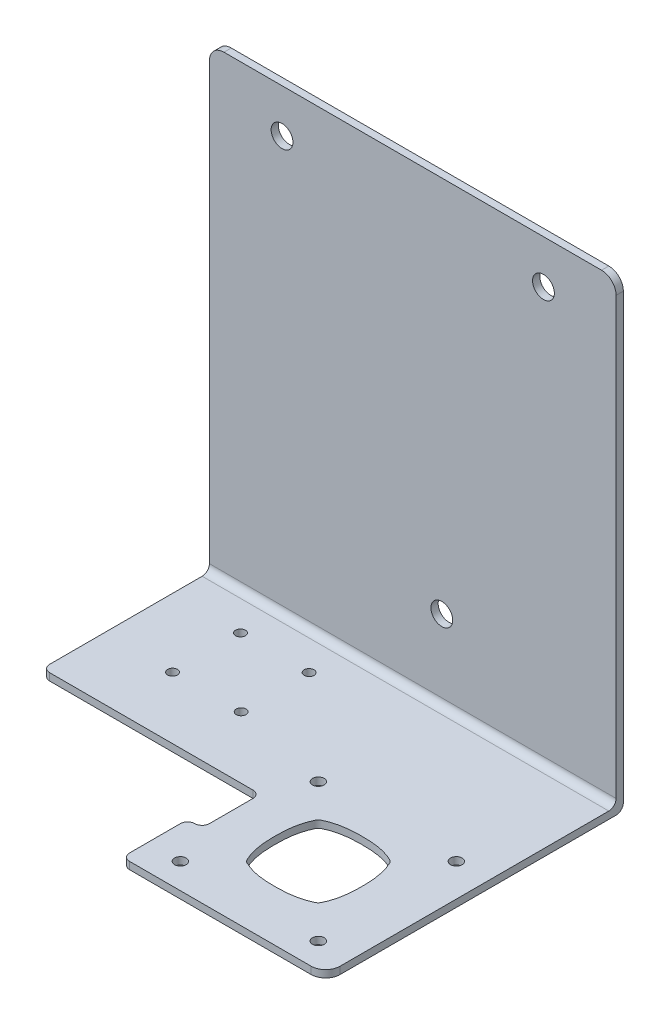
ISO-10303-21;
HEADER;
FILE_DESCRIPTION(('STEP AP214'),'2;1');
FILE_NAME('part.step','',(''),(''),'','','');
FILE_SCHEMA(('AUTOMOTIVE_DESIGN { 1 0 10303 214 1 1 1 1 }'));
ENDSEC;
DATA;
#1=APPLICATION_CONTEXT('core data for automotive mechanical design processes');
#2=APPLICATION_PROTOCOL_DEFINITION('international standard','automotive_design',2000,#1);
#3=PRODUCT_CONTEXT('',#1,'mechanical');
#4=PRODUCT('Part','Part','',(#3));
#5=PRODUCT_RELATED_PRODUCT_CATEGORY('part','',(#4));
#6=PRODUCT_DEFINITION_FORMATION('','',#4);
#7=PRODUCT_DEFINITION_CONTEXT('part definition',#1,'design');
#8=PRODUCT_DEFINITION('design','',#6,#7);
#9=PRODUCT_DEFINITION_SHAPE('','',#8);
#10=(LENGTH_UNIT() NAMED_UNIT(*) SI_UNIT(.MILLI.,.METRE.));
#11=(NAMED_UNIT(*) PLANE_ANGLE_UNIT() SI_UNIT($,.RADIAN.));
#12=(NAMED_UNIT(*) SI_UNIT($,.STERADIAN.) SOLID_ANGLE_UNIT());
#13=UNCERTAINTY_MEASURE_WITH_UNIT(LENGTH_MEASURE(1.E-05),#10,'distance_accuracy_value','');
#14=(GEOMETRIC_REPRESENTATION_CONTEXT(3) GLOBAL_UNCERTAINTY_ASSIGNED_CONTEXT((#13)) GLOBAL_UNIT_ASSIGNED_CONTEXT((#10,
#11,#12)) REPRESENTATION_CONTEXT('',''));
#15=CARTESIAN_POINT('',(0.,0.,0.));
#16=DIRECTION('',(0.,0.,1.));
#17=DIRECTION('',(1.,0.,0.));
#18=AXIS2_PLACEMENT_3D('',#15,#16,#17);
#19=CARTESIAN_POINT('',(0.,0.,3.175));
#20=DIRECTION('',(0.,0.,-1.));
#21=DIRECTION('',(-1.,0.,0.));
#22=AXIS2_PLACEMENT_3D('',#19,#20,#21);
#23=PLANE('',#22);
#24=CARTESIAN_POINT('',(-57.15,82.55,3.175));
#25=DIRECTION('',(0.,0.,1.));
#26=DIRECTION('',(1.,0.,0.));
#27=AXIS2_PLACEMENT_3D('',#24,#25,#26);
#28=CIRCLE('',#27,4.7625);
#29=CARTESIAN_POINT('',(-52.3875,82.55,3.175));
#30=VERTEX_POINT('',#29);
#31=EDGE_CURVE('E524',#30,#30,#28,.T.);
#32=ORIENTED_EDGE('',*,*,#31,.F.);
#33=EDGE_LOOP('',(#32));
#34=FACE_BOUND('',#33,.T.);
#35=CARTESIAN_POINT('',(57.15,82.55,3.175));
#36=DIRECTION('',(0.,0.,1.));
#37=DIRECTION('',(1.,0.,0.));
#38=AXIS2_PLACEMENT_3D('',#35,#36,#37);
#39=CIRCLE('',#38,4.7625);
#40=CARTESIAN_POINT('',(61.9125,82.55,3.175));
#41=VERTEX_POINT('',#40);
#42=EDGE_CURVE('E518',#41,#41,#39,.T.);
#43=ORIENTED_EDGE('',*,*,#42,.F.);
#44=EDGE_LOOP('',(#43));
#45=FACE_BOUND('',#44,.T.);
#46=CARTESIAN_POINT('',(12.7,-63.5,3.175));
#47=DIRECTION('',(0.,0.,1.));
#48=DIRECTION('',(1.,0.,0.));
#49=AXIS2_PLACEMENT_3D('',#46,#47,#48);
#50=CIRCLE('',#49,4.76250000000001);
#51=CARTESIAN_POINT('',(17.4625,-63.5,3.175));
#52=VERTEX_POINT('',#51);
#53=EDGE_CURVE('E511',#52,#52,#50,.T.);
#54=ORIENTED_EDGE('',*,*,#53,.F.);
#55=EDGE_LOOP('',(#54));
#56=FACE_BOUND('',#55,.T.);
#57=DIRECTION('',(0.,1.,0.));
#58=VECTOR('',#57,1.);
#59=CARTESIAN_POINT('',(88.9,-101.6,3.175));
#60=LINE('',#59,#58);
#61=CARTESIAN_POINT('',(88.9,-95.25,3.175));
#62=VERTEX_POINT('',#61);
#63=CARTESIAN_POINT('',(88.9,95.25,3.175));
#64=VERTEX_POINT('',#63);
#65=EDGE_CURVE('E327',#62,#64,#60,.T.);
#66=ORIENTED_EDGE('',*,*,#65,.T.);
#67=CARTESIAN_POINT('',(82.55,95.25,3.175));
#68=DIRECTION('',(0.,0.,-1.));
#69=DIRECTION('',(-1.,0.,0.));
#70=AXIS2_PLACEMENT_3D('',#67,#68,#69);
#71=CIRCLE('',#70,6.35);
#72=CARTESIAN_POINT('',(82.55,101.6,3.175));
#73=VERTEX_POINT('',#72);
#74=EDGE_CURVE('E226',#64,#73,#71,.F.);
#75=ORIENTED_EDGE('',*,*,#74,.T.);
#76=DIRECTION('',(-1.,0.,0.));
#77=VECTOR('',#76,1.);
#78=CARTESIAN_POINT('',(-88.9,101.6,3.175));
#79=LINE('',#78,#77);
#80=CARTESIAN_POINT('',(-82.55,101.6,3.175));
#81=VERTEX_POINT('',#80);
#82=EDGE_CURVE('E330',#73,#81,#79,.T.);
#83=ORIENTED_EDGE('',*,*,#82,.T.);
#84=CARTESIAN_POINT('',(-82.55,95.25,3.175));
#85=DIRECTION('',(0.,0.,-1.));
#86=DIRECTION('',(-1.,0.,0.));
#87=AXIS2_PLACEMENT_3D('',#84,#85,#86);
#88=CIRCLE('',#87,6.35);
#89=CARTESIAN_POINT('',(-88.9,95.25,3.175));
#90=VERTEX_POINT('',#89);
#91=EDGE_CURVE('E224',#81,#90,#88,.F.);
#92=ORIENTED_EDGE('',*,*,#91,.T.);
#93=DIRECTION('',(0.,-1.,0.));
#94=VECTOR('',#93,1.);
#95=CARTESIAN_POINT('',(-88.9,-101.6,3.175));
#96=LINE('',#95,#94);
#97=CARTESIAN_POINT('',(-88.9,-95.25,3.175));
#98=VERTEX_POINT('',#97);
#99=EDGE_CURVE('E180',#90,#98,#96,.T.);
#100=ORIENTED_EDGE('',*,*,#99,.T.);
#101=DIRECTION('',(-1.,0.,0.));
#102=VECTOR('',#101,1.);
#103=CARTESIAN_POINT('',(88.9,-95.25,3.175));
#104=LINE('',#103,#102);
#105=EDGE_CURVE('E204',#98,#62,#104,.F.);
#106=ORIENTED_EDGE('',*,*,#105,.T.);
#107=EDGE_LOOP('',(#66,#75,#83,#92,#100,#106));
#108=FACE_BOUND('',#107,.T.);
#109=ADVANCED_FACE('F33',(#34,#45,#56,#108),#23,.F.);
#110=CARTESIAN_POINT('',(88.9,-101.6,3.175));
#111=DIRECTION('',(-1.,0.,0.));
#112=DIRECTION('',(0.,0.,1.));
#113=AXIS2_PLACEMENT_3D('',#110,#111,#112);
#114=PLANE('',#113);
#115=DIRECTION('',(0.,1.,0.));
#116=VECTOR('',#115,1.);
#117=CARTESIAN_POINT('',(88.9,-101.6,0.));
#118=LINE('',#117,#116);
#119=CARTESIAN_POINT('',(88.9,-98.425,0.));
#120=VERTEX_POINT('',#119);
#121=CARTESIAN_POINT('',(88.9,95.25,0.));
#122=VERTEX_POINT('',#121);
#123=EDGE_CURVE('E326',#120,#122,#118,.T.);
#124=ORIENTED_EDGE('',*,*,#123,.T.);
#125=DIRECTION('',(0.,0.,-1.));
#126=VECTOR('',#125,1.);
#127=CARTESIAN_POINT('',(88.9,95.25,3.175));
#128=LINE('',#127,#126);
#129=EDGE_CURVE('E222',#122,#64,#128,.F.);
#130=ORIENTED_EDGE('',*,*,#129,.T.);
#131=ORIENTED_EDGE('',*,*,#65,.F.);
#132=CARTESIAN_POINT('',(88.9,-95.25,6.34999999999999));
#133=DIRECTION('',(-1.,0.,0.));
#134=DIRECTION('',(0.,0.,1.));
#135=AXIS2_PLACEMENT_3D('',#132,#133,#134);
#136=CIRCLE('',#135,3.175);
#137=CARTESIAN_POINT('',(88.9,-98.425,6.34999999999999));
#138=VERTEX_POINT('',#137);
#139=EDGE_CURVE('E209',#62,#138,#136,.T.);
#140=ORIENTED_EDGE('',*,*,#139,.T.);
#141=DIRECTION('',(0.,0.,-1.));
#142=VECTOR('',#141,1.);
#143=CARTESIAN_POINT('',(88.9,-98.425,130.175));
#144=LINE('',#143,#142);
#145=CARTESIAN_POINT('',(88.9,-98.425,123.825));
#146=VERTEX_POINT('',#145);
#147=EDGE_CURVE('E324',#146,#138,#144,.T.);
#148=ORIENTED_EDGE('',*,*,#147,.F.);
#149=DIRECTION('',(0.,1.,0.));
#150=VECTOR('',#149,1.);
#151=CARTESIAN_POINT('',(88.9,-101.6,123.825));
#152=LINE('',#151,#150);
#153=CARTESIAN_POINT('',(88.9,-101.6,123.825));
#154=VERTEX_POINT('',#153);
#155=EDGE_CURVE('E174',#146,#154,#152,.F.);
#156=ORIENTED_EDGE('',*,*,#155,.T.);
#157=DIRECTION('',(0.,0.,-1.));
#158=VECTOR('',#157,1.);
#159=CARTESIAN_POINT('',(88.9,-101.6,3.175));
#160=LINE('',#159,#158);
#161=CARTESIAN_POINT('',(88.9,-101.6,3.175));
#162=VERTEX_POINT('',#161);
#163=EDGE_CURVE('E166',#154,#162,#160,.T.);
#164=ORIENTED_EDGE('',*,*,#163,.T.);
#165=CARTESIAN_POINT('',(88.9,-98.425,3.175));
#166=DIRECTION('',(-1.,0.,0.));
#167=DIRECTION('',(0.,0.,1.));
#168=AXIS2_PLACEMENT_3D('',#165,#166,#167);
#169=CIRCLE('',#168,3.175);
#170=EDGE_CURVE('E170',#162,#120,#169,.F.);
#171=ORIENTED_EDGE('',*,*,#170,.T.);
#172=EDGE_LOOP('',(#124,#130,#131,#140,#148,#156,#164,#171));
#173=FACE_BOUND('',#172,.T.);
#174=ADVANCED_FACE('F169',(#173),#114,.F.);
#175=CARTESIAN_POINT('',(-88.9,101.6,3.175));
#176=DIRECTION('',(0.,-1.,0.));
#177=DIRECTION('',(0.,0.,-1.));
#178=AXIS2_PLACEMENT_3D('',#175,#176,#177);
#179=PLANE('',#178);
#180=ORIENTED_EDGE('',*,*,#82,.F.);
#181=DIRECTION('',(0.,0.,-1.));
#182=VECTOR('',#181,1.);
#183=CARTESIAN_POINT('',(82.55,101.6,3.175));
#184=LINE('',#183,#182);
#185=CARTESIAN_POINT('',(82.55,101.6,0.));
#186=VERTEX_POINT('',#185);
#187=EDGE_CURVE('E214',#73,#186,#184,.T.);
#188=ORIENTED_EDGE('',*,*,#187,.T.);
#189=DIRECTION('',(-1.,0.,0.));
#190=VECTOR('',#189,1.);
#191=CARTESIAN_POINT('',(-88.9,101.6,0.));
#192=LINE('',#191,#190);
#193=CARTESIAN_POINT('',(-82.55,101.6,0.));
#194=VERTEX_POINT('',#193);
#195=EDGE_CURVE('E336',#186,#194,#192,.T.);
#196=ORIENTED_EDGE('',*,*,#195,.T.);
#197=DIRECTION('',(0.,0.,-1.));
#198=VECTOR('',#197,1.);
#199=CARTESIAN_POINT('',(-82.55,101.6,3.175));
#200=LINE('',#199,#198);
#201=EDGE_CURVE('E212',#194,#81,#200,.F.);
#202=ORIENTED_EDGE('',*,*,#201,.T.);
#203=EDGE_LOOP('',(#180,#188,#196,#202));
#204=FACE_BOUND('',#203,.T.);
#205=ADVANCED_FACE('F357',(#204),#179,.F.);
#206=CARTESIAN_POINT('',(-88.9,-101.6,3.175));
#207=DIRECTION('',(1.,0.,0.));
#208=DIRECTION('',(0.,0.,-1.));
#209=AXIS2_PLACEMENT_3D('',#206,#207,#208);
#210=PLANE('',#209);
#211=DIRECTION('',(0.,0.,-1.));
#212=VECTOR('',#211,1.);
#213=CARTESIAN_POINT('',(-88.9,-101.6,3.175));
#214=LINE('',#213,#212);
#215=CARTESIAN_POINT('',(-88.9,-101.6,73.025));
#216=VERTEX_POINT('',#215);
#217=CARTESIAN_POINT('',(-88.9,-101.6,3.175));
#218=VERTEX_POINT('',#217);
#219=EDGE_CURVE('E179',#216,#218,#214,.T.);
#220=ORIENTED_EDGE('',*,*,#219,.F.);
#221=DIRECTION('',(0.,-1.,0.));
#222=VECTOR('',#221,1.);
#223=CARTESIAN_POINT('',(-88.9,-101.6,73.025));
#224=LINE('',#223,#222);
#225=CARTESIAN_POINT('',(-88.9,-98.425,73.025));
#226=VERTEX_POINT('',#225);
#227=EDGE_CURVE('E261',#216,#226,#224,.F.);
#228=ORIENTED_EDGE('',*,*,#227,.T.);
#229=DIRECTION('',(0.,0.,-1.));
#230=VECTOR('',#229,1.);
#231=CARTESIAN_POINT('',(-88.9,-98.425,130.175));
#232=LINE('',#231,#230);
#233=CARTESIAN_POINT('',(-88.9,-98.425,6.34999999999999));
#234=VERTEX_POINT('',#233);
#235=EDGE_CURVE('E322',#226,#234,#232,.T.);
#236=ORIENTED_EDGE('',*,*,#235,.T.);
#237=CARTESIAN_POINT('',(-88.9,-95.25,6.34999999999999));
#238=DIRECTION('',(1.,0.,0.));
#239=DIRECTION('',(0.,0.,-1.));
#240=AXIS2_PLACEMENT_3D('',#237,#238,#239);
#241=CIRCLE('',#240,3.175);
#242=EDGE_CURVE('E206',#234,#98,#241,.T.);
#243=ORIENTED_EDGE('',*,*,#242,.T.);
#244=ORIENTED_EDGE('',*,*,#99,.F.);
#245=DIRECTION('',(0.,0.,-1.));
#246=VECTOR('',#245,1.);
#247=CARTESIAN_POINT('',(-88.9,95.25,3.175));
#248=LINE('',#247,#246);
#249=CARTESIAN_POINT('',(-88.9,95.25,0.));
#250=VERTEX_POINT('',#249);
#251=EDGE_CURVE('E228',#90,#250,#248,.T.);
#252=ORIENTED_EDGE('',*,*,#251,.T.);
#253=DIRECTION('',(0.,-1.,0.));
#254=VECTOR('',#253,1.);
#255=CARTESIAN_POINT('',(-88.9,-101.6,0.));
#256=LINE('',#255,#254);
#257=CARTESIAN_POINT('',(-88.9,-98.425,0.));
#258=VERTEX_POINT('',#257);
#259=EDGE_CURVE('E331',#250,#258,#256,.T.);
#260=ORIENTED_EDGE('',*,*,#259,.T.);
#261=CARTESIAN_POINT('',(-88.9,-98.425,3.175));
#262=DIRECTION('',(1.,0.,0.));
#263=DIRECTION('',(0.,0.,-1.));
#264=AXIS2_PLACEMENT_3D('',#261,#262,#263);
#265=CIRCLE('',#264,3.175);
#266=EDGE_CURVE('E199',#258,#218,#265,.F.);
#267=ORIENTED_EDGE('',*,*,#266,.T.);
#268=EDGE_LOOP('',(#220,#228,#236,#243,#244,#252,#260,#267));
#269=FACE_BOUND('',#268,.T.);
#270=ADVANCED_FACE('F341',(#269),#210,.F.);
#271=CARTESIAN_POINT('',(-88.9,-101.6,3.175));
#272=DIRECTION('',(0.,1.,0.));
#273=DIRECTION('',(0.,0.,1.));
#274=AXIS2_PLACEMENT_3D('',#271,#272,#273);
#275=PLANE('',#274);
#276=CARTESIAN_POINT('',(59.248488812379,-101.6,105.191004458203));
#277=CARTESIAN_POINT('',(59.5791310842276,-101.6,105.028544345858));
#278=CARTESIAN_POINT('',(60.235404786611,-101.6,104.685404786611));
#279=CARTESIAN_POINT('',(62.9698183631979,-101.6,99.4556850606386));
#280=CARTESIAN_POINT('',(63.994688585421,-101.6,88.8999999998624));
#281=CARTESIAN_POINT('',(62.9698183630822,-101.6,78.3443149391391));
#282=CARTESIAN_POINT('',(60.2354047866109,-101.6,73.114595213389));
#283=CARTESIAN_POINT('',(55.0056850606331,-101.6,70.3801816368017));
#284=CARTESIAN_POINT('',(44.4499999998614,-101.6,69.355311414428));
#285=CARTESIAN_POINT('',(33.8943149391428,-101.6,70.3801816369182));
#286=CARTESIAN_POINT('',(28.6645952133889,-101.6,73.1145952133891));
#287=CARTESIAN_POINT('',(25.930181636802,-101.6,78.3443149393661));
#288=CARTESIAN_POINT('',(24.90531141446,-101.6,88.9000000001377));
#289=CARTESIAN_POINT('',(25.9301816369179,-101.6,99.4556850608581));
#290=CARTESIAN_POINT('',(28.664595213389,-101.6,104.685404786611));
#291=CARTESIAN_POINT('',(33.8943149393609,-101.6,107.419818363198));
#292=CARTESIAN_POINT('',(44.4500000001374,-101.6,108.444688585389));
#293=CARTESIAN_POINT('',(54.6401231934281,-101.6,107.455311414475));
#294=CARTESIAN_POINT('',(59.248488812379,-101.6,105.191004458203));
#295=B_SPLINE_CURVE_WITH_KNOTS('',3,(#276,#277,#278,#279,#280,#281,#282,#283,#284,#285,#286,
#287,#288,#289,#290,#291,#292,#293,#294),.UNSPECIFIED.,.T.,.F.,(4,1,1,1,1,1,1,1,1,1,1,1,1,1,1,1,
4),(0.,0.00836813483475174,0.0167362696695037,0.133368134837552,0.249999999999913,
0.258368134834665,0.266736269669416,0.383368134837594,0.500000000000047,0.508368134834801,
0.516736269669551,0.633368134837695,0.750000000000134,0.758368134834886,0.766736269669638,
0.883368134837663,1.),.UNSPECIFIED.);
#296=CARTESIAN_POINT('',(59.248488812379,-101.6,105.191004458203));
#297=VERTEX_POINT('',#296);
#298=EDGE_CURVE('E515',#297,#297,#295,.T.);
#299=ORIENTED_EDGE('',*,*,#298,.T.);
#300=EDGE_LOOP('',(#299));
#301=FACE_BOUND('',#300,.T.);
#302=CARTESIAN_POINT('',(-29.05,-101.6,49.1400372285927));
#303=DIRECTION('',(0.,1.,0.));
#304=DIRECTION('',(0.,0.,1.));
#305=AXIS2_PLACEMENT_3D('',#302,#303,#304);
#306=CIRCLE('',#305,2.14999999999998);
#307=CARTESIAN_POINT('',(-29.05,-101.6,51.2900372285927));
#308=VERTEX_POINT('',#307);
#309=EDGE_CURVE('E492',#308,#308,#306,.T.);
#310=ORIENTED_EDGE('',*,*,#309,.T.);
#311=EDGE_LOOP('',(#310));
#312=FACE_BOUND('',#311,.T.);
#313=CARTESIAN_POINT('',(74.6124999999998,-101.6,58.7375));
#314=DIRECTION('',(0.,1.,0.));
#315=DIRECTION('',(0.,0.,1.));
#316=AXIS2_PLACEMENT_3D('',#313,#314,#315);
#317=CIRCLE('',#316,2.54);
#318=CARTESIAN_POINT('',(74.6124999999998,-101.6,61.2775));
#319=VERTEX_POINT('',#318);
#320=EDGE_CURVE('E487',#319,#319,#317,.T.);
#321=ORIENTED_EDGE('',*,*,#320,.T.);
#322=EDGE_LOOP('',(#321));
#323=FACE_BOUND('',#322,.T.);
#324=CARTESIAN_POINT('',(14.2874999999998,-101.6,58.7375));
#325=DIRECTION('',(0.,1.,0.));
#326=DIRECTION('',(0.,0.,1.));
#327=AXIS2_PLACEMENT_3D('',#324,#325,#326);
#328=CIRCLE('',#327,2.54);
#329=CARTESIAN_POINT('',(14.2874999999998,-101.6,61.2775));
#330=VERTEX_POINT('',#329);
#331=EDGE_CURVE('E486',#330,#330,#328,.T.);
#332=ORIENTED_EDGE('',*,*,#331,.T.);
#333=EDGE_LOOP('',(#332));
#334=FACE_BOUND('',#333,.T.);
#335=CARTESIAN_POINT('',(14.2874999999998,-101.6,119.0625));
#336=DIRECTION('',(0.,1.,0.));
#337=DIRECTION('',(0.,0.,1.));
#338=AXIS2_PLACEMENT_3D('',#335,#336,#337);
#339=CIRCLE('',#338,2.54);
#340=CARTESIAN_POINT('',(14.2874999999998,-101.6,121.6025));
#341=VERTEX_POINT('',#340);
#342=EDGE_CURVE('E479',#341,#341,#339,.T.);
#343=ORIENTED_EDGE('',*,*,#342,.T.);
#344=EDGE_LOOP('',(#343));
#345=FACE_BOUND('',#344,.T.);
#346=CARTESIAN_POINT('',(-59.0499999999999,-101.6,19.4400372285927));
#347=DIRECTION('',(0.,1.,0.));
#348=DIRECTION('',(0.,0.,1.));
#349=AXIS2_PLACEMENT_3D('',#346,#347,#348);
#350=CIRCLE('',#349,2.14999999999999);
#351=CARTESIAN_POINT('',(-59.0499999999999,-101.6,21.5900372285927));
#352=VERTEX_POINT('',#351);
#353=EDGE_CURVE('E501',#352,#352,#350,.T.);
#354=ORIENTED_EDGE('',*,*,#353,.T.);
#355=EDGE_LOOP('',(#354));
#356=FACE_BOUND('',#355,.T.);
#357=CARTESIAN_POINT('',(-29.05,-101.6,19.4400372285927));
#358=DIRECTION('',(0.,1.,0.));
#359=DIRECTION('',(0.,0.,1.));
#360=AXIS2_PLACEMENT_3D('',#357,#358,#359);
#361=CIRCLE('',#360,2.14999999999999);
#362=CARTESIAN_POINT('',(-29.05,-101.6,21.5900372285927));
#363=VERTEX_POINT('',#362);
#364=EDGE_CURVE('E500',#363,#363,#361,.T.);
#365=ORIENTED_EDGE('',*,*,#364,.T.);
#366=EDGE_LOOP('',(#365));
#367=FACE_BOUND('',#366,.T.);
#368=CARTESIAN_POINT('',(-59.0499999999997,-101.6,49.1400372285927));
#369=DIRECTION('',(0.,1.,0.));
#370=DIRECTION('',(0.,0.,1.));
#371=AXIS2_PLACEMENT_3D('',#368,#369,#370);
#372=CIRCLE('',#371,2.14999999999998);
#373=CARTESIAN_POINT('',(-59.0499999999997,-101.6,51.2900372285927));
#374=VERTEX_POINT('',#373);
#375=EDGE_CURVE('E493',#374,#374,#372,.T.);
#376=ORIENTED_EDGE('',*,*,#375,.T.);
#377=EDGE_LOOP('',(#376));
#378=FACE_BOUND('',#377,.T.);
#379=CARTESIAN_POINT('',(74.6124999999998,-101.6,119.0625));
#380=DIRECTION('',(0.,1.,0.));
#381=DIRECTION('',(0.,0.,1.));
#382=AXIS2_PLACEMENT_3D('',#379,#380,#381);
#383=CIRCLE('',#382,2.54000000000001);
#384=CARTESIAN_POINT('',(74.6124999999998,-101.6,121.6025));
#385=VERTEX_POINT('',#384);
#386=EDGE_CURVE('E478',#385,#385,#383,.T.);
#387=ORIENTED_EDGE('',*,*,#386,.T.);
#388=EDGE_LOOP('',(#387));
#389=FACE_BOUND('',#388,.T.);
#390=DIRECTION('',(-1.,0.,0.));
#391=VECTOR('',#390,1.);
#392=CARTESIAN_POINT('',(-88.9,-101.6,76.2));
#393=LINE('',#392,#391);
#394=CARTESIAN_POINT('',(3.175,-101.6,76.2));
#395=VERTEX_POINT('',#394);
#396=CARTESIAN_POINT('',(-85.725,-101.6,76.2));
#397=VERTEX_POINT('',#396);
#398=EDGE_CURVE('E280',#395,#397,#393,.T.);
#399=ORIENTED_EDGE('',*,*,#398,.T.);
#400=CARTESIAN_POINT('',(-85.725,-101.6,73.025));
#401=DIRECTION('',(0.,1.,0.));
#402=DIRECTION('',(0.,0.,1.));
#403=AXIS2_PLACEMENT_3D('',#400,#401,#402);
#404=CIRCLE('',#403,3.175);
#405=EDGE_CURVE('E259',#397,#216,#404,.F.);
#406=ORIENTED_EDGE('',*,*,#405,.T.);
#407=ORIENTED_EDGE('',*,*,#219,.T.);
#408=DIRECTION('',(1.,0.,0.));
#409=VECTOR('',#408,1.);
#410=CARTESIAN_POINT('',(88.9,-101.6,3.175));
#411=LINE('',#410,#409);
#412=EDGE_CURVE('E187',#218,#162,#411,.T.);
#413=ORIENTED_EDGE('',*,*,#412,.T.);
#414=ORIENTED_EDGE('',*,*,#163,.F.);
#415=CARTESIAN_POINT('',(82.55,-101.6,123.825));
#416=DIRECTION('',(0.,1.,0.));
#417=DIRECTION('',(0.,0.,1.));
#418=AXIS2_PLACEMENT_3D('',#415,#416,#417);
#419=CIRCLE('',#418,6.35);
#420=CARTESIAN_POINT('',(82.55,-101.6,130.175));
#421=VERTEX_POINT('',#420);
#422=EDGE_CURVE('E236',#154,#421,#419,.F.);
#423=ORIENTED_EDGE('',*,*,#422,.T.);
#424=DIRECTION('',(1.,0.,0.));
#425=VECTOR('',#424,1.);
#426=CARTESIAN_POINT('',(-88.9,-101.6,130.175));
#427=LINE('',#426,#425);
#428=CARTESIAN_POINT('',(3.17499999999991,-101.6,130.175));
#429=VERTEX_POINT('',#428);
#430=EDGE_CURVE('E290',#429,#421,#427,.T.);
#431=ORIENTED_EDGE('',*,*,#430,.F.);
#432=CARTESIAN_POINT('',(3.17499999999992,-101.6,127.));
#433=DIRECTION('',(0.,1.,0.));
#434=DIRECTION('',(0.,0.,1.));
#435=AXIS2_PLACEMENT_3D('',#432,#433,#434);
#436=CIRCLE('',#435,3.175);
#437=CARTESIAN_POINT('',(0.,-101.6,127.));
#438=VERTEX_POINT('',#437);
#439=EDGE_CURVE('E257',#429,#438,#436,.F.);
#440=ORIENTED_EDGE('',*,*,#439,.T.);
#441=DIRECTION('',(0.,0.,-1.));
#442=VECTOR('',#441,1.);
#443=CARTESIAN_POINT('',(0.,-101.6,3.17500000000001));
#444=LINE('',#443,#442);
#445=CARTESIAN_POINT('',(0.,-101.6,104.775));
#446=VERTEX_POINT('',#445);
#447=EDGE_CURVE('E311',#438,#446,#444,.T.);
#448=ORIENTED_EDGE('',*,*,#447,.T.);
#449=CARTESIAN_POINT('',(3.17499999999992,-101.6,104.775));
#450=DIRECTION('',(0.,1.,0.));
#451=DIRECTION('',(0.,0.,1.));
#452=AXIS2_PLACEMENT_3D('',#449,#450,#451);
#453=CIRCLE('',#452,3.175);
#454=CARTESIAN_POINT('',(3.17499999999991,-101.6,101.6));
#455=VERTEX_POINT('',#454);
#456=EDGE_CURVE('E255',#446,#455,#453,.F.);
#457=ORIENTED_EDGE('',*,*,#456,.T.);
#458=CARTESIAN_POINT('',(3.175,-101.6,98.425));
#459=DIRECTION('',(0.,1.,0.));
#460=DIRECTION('',(0.,0.,1.));
#461=AXIS2_PLACEMENT_3D('',#458,#459,#460);
#462=CIRCLE('',#461,3.175);
#463=CARTESIAN_POINT('',(6.34999999999999,-101.6,98.425));
#464=VERTEX_POINT('',#463);
#465=EDGE_CURVE('E274',#455,#464,#462,.T.);
#466=ORIENTED_EDGE('',*,*,#465,.T.);
#467=DIRECTION('',(0.,0.,-1.));
#468=VECTOR('',#467,1.);
#469=CARTESIAN_POINT('',(6.34999999999998,-101.6,3.17499999999999));
#470=LINE('',#469,#468);
#471=CARTESIAN_POINT('',(6.34999999999999,-101.6,79.375));
#472=VERTEX_POINT('',#471);
#473=EDGE_CURVE('E282',#464,#472,#470,.T.);
#474=ORIENTED_EDGE('',*,*,#473,.T.);
#475=CARTESIAN_POINT('',(3.17499999999999,-101.6,79.375));
#476=DIRECTION('',(0.,1.,0.));
#477=DIRECTION('',(0.,0.,1.));
#478=AXIS2_PLACEMENT_3D('',#475,#476,#477);
#479=CIRCLE('',#478,3.175);
#480=EDGE_CURVE('E42',#472,#395,#479,.T.);
#481=ORIENTED_EDGE('',*,*,#480,.T.);
#482=EDGE_LOOP('',(#399,#406,#407,#413,#414,#423,#431,#440,#448,#457,#466,#474,#481));
#483=FACE_BOUND('',#482,.T.);
#484=ADVANCED_FACE('F192',(#301,#312,#323,#334,#345,#356,#367,#378,#389,#483),#275,.F.);
#485=CARTESIAN_POINT('',(0.,0.,0.));
#486=DIRECTION('',(0.,0.,-1.));
#487=DIRECTION('',(-1.,0.,0.));
#488=AXIS2_PLACEMENT_3D('',#485,#486,#487);
#489=PLANE('',#488);
#490=CARTESIAN_POINT('',(-57.15,82.55,0.));
#491=DIRECTION('',(0.,0.,1.));
#492=DIRECTION('',(1.,0.,0.));
#493=AXIS2_PLACEMENT_3D('',#490,#491,#492);
#494=CIRCLE('',#493,4.7625);
#495=CARTESIAN_POINT('',(-52.3875,82.55,0.));
#496=VERTEX_POINT('',#495);
#497=EDGE_CURVE('E508',#496,#496,#494,.T.);
#498=ORIENTED_EDGE('',*,*,#497,.T.);
#499=EDGE_LOOP('',(#498));
#500=FACE_BOUND('',#499,.T.);
#501=CARTESIAN_POINT('',(57.15,82.55,0.));
#502=DIRECTION('',(0.,0.,1.));
#503=DIRECTION('',(1.,0.,0.));
#504=AXIS2_PLACEMENT_3D('',#501,#502,#503);
#505=CIRCLE('',#504,4.7625);
#506=CARTESIAN_POINT('',(61.9125,82.55,0.));
#507=VERTEX_POINT('',#506);
#508=EDGE_CURVE('E521',#507,#507,#505,.T.);
#509=ORIENTED_EDGE('',*,*,#508,.T.);
#510=EDGE_LOOP('',(#509));
#511=FACE_BOUND('',#510,.T.);
#512=CARTESIAN_POINT('',(12.7,-63.5,0.));
#513=DIRECTION('',(0.,0.,1.));
#514=DIRECTION('',(1.,0.,0.));
#515=AXIS2_PLACEMENT_3D('',#512,#513,#514);
#516=CIRCLE('',#515,4.76250000000001);
#517=CARTESIAN_POINT('',(17.4625,-63.5,0.));
#518=VERTEX_POINT('',#517);
#519=EDGE_CURVE('E514',#518,#518,#516,.T.);
#520=ORIENTED_EDGE('',*,*,#519,.T.);
#521=EDGE_LOOP('',(#520));
#522=FACE_BOUND('',#521,.T.);
#523=ORIENTED_EDGE('',*,*,#195,.F.);
#524=CARTESIAN_POINT('',(82.55,95.25,0.));
#525=DIRECTION('',(0.,0.,-1.));
#526=DIRECTION('',(-1.,0.,0.));
#527=AXIS2_PLACEMENT_3D('',#524,#525,#526);
#528=CIRCLE('',#527,6.35);
#529=EDGE_CURVE('E219',#186,#122,#528,.T.);
#530=ORIENTED_EDGE('',*,*,#529,.T.);
#531=ORIENTED_EDGE('',*,*,#123,.F.);
#532=DIRECTION('',(1.,0.,0.));
#533=VECTOR('',#532,1.);
#534=CARTESIAN_POINT('',(-88.9,-98.425,0.));
#535=LINE('',#534,#533);
#536=EDGE_CURVE('E189',#120,#258,#535,.F.);
#537=ORIENTED_EDGE('',*,*,#536,.T.);
#538=ORIENTED_EDGE('',*,*,#259,.F.);
#539=CARTESIAN_POINT('',(-82.55,95.25,0.));
#540=DIRECTION('',(0.,0.,-1.));
#541=DIRECTION('',(-1.,0.,0.));
#542=AXIS2_PLACEMENT_3D('',#539,#540,#541);
#543=CIRCLE('',#542,6.35);
#544=EDGE_CURVE('E217',#250,#194,#543,.T.);
#545=ORIENTED_EDGE('',*,*,#544,.T.);
#546=EDGE_LOOP('',(#523,#530,#531,#537,#538,#545));
#547=FACE_BOUND('',#546,.T.);
#548=ADVANCED_FACE('F346',(#500,#511,#522,#547),#489,.T.);
#549=CARTESIAN_POINT('',(-88.9,-98.425,130.175));
#550=DIRECTION('',(0.,-1.,0.));
#551=DIRECTION('',(0.,0.,-1.));
#552=AXIS2_PLACEMENT_3D('',#549,#550,#551);
#553=PLANE('',#552);
#554=CARTESIAN_POINT('',(59.248488812379,-98.425,105.191004458203));
#555=CARTESIAN_POINT('',(59.5791310842276,-98.425,105.028544345858));
#556=CARTESIAN_POINT('',(60.235404786611,-98.425,104.685404786611));
#557=CARTESIAN_POINT('',(62.9698183631979,-98.425,99.4556850606386));
#558=CARTESIAN_POINT('',(63.994688585421,-98.425,88.8999999998624));
#559=CARTESIAN_POINT('',(62.9698183630822,-98.425,78.3443149391391));
#560=CARTESIAN_POINT('',(60.2354047866109,-98.425,73.114595213389));
#561=CARTESIAN_POINT('',(55.0056850606331,-98.425,70.3801816368017));
#562=CARTESIAN_POINT('',(44.4499999998614,-98.425,69.355311414428));
#563=CARTESIAN_POINT('',(33.8943149391428,-98.425,70.3801816369182));
#564=CARTESIAN_POINT('',(28.6645952133889,-98.425,73.1145952133891));
#565=CARTESIAN_POINT('',(25.930181636802,-98.425,78.3443149393661));
#566=CARTESIAN_POINT('',(24.90531141446,-98.425,88.9000000001377));
#567=CARTESIAN_POINT('',(25.9301816369179,-98.425,99.4556850608581));
#568=CARTESIAN_POINT('',(28.664595213389,-98.425,104.685404786611));
#569=CARTESIAN_POINT('',(33.8943149393609,-98.425,107.419818363198));
#570=CARTESIAN_POINT('',(44.4500000001374,-98.425,108.444688585389));
#571=CARTESIAN_POINT('',(54.6401231934281,-98.425,107.455311414475));
#572=CARTESIAN_POINT('',(59.248488812379,-98.425,105.191004458203));
#573=B_SPLINE_CURVE_WITH_KNOTS('',3,(#554,#555,#556,#557,#558,#559,#560,#561,#562,#563,#564,
#565,#566,#567,#568,#569,#570,#571,#572),.UNSPECIFIED.,.T.,.F.,(4,1,1,1,1,1,1,1,1,1,1,1,1,1,1,1,
4),(0.,0.00836813483475174,0.0167362696695037,0.133368134837552,0.249999999999913,
0.258368134834665,0.266736269669416,0.383368134837594,0.500000000000047,0.508368134834801,
0.516736269669551,0.633368134837695,0.750000000000134,0.758368134834886,0.766736269669638,
0.883368134837663,1.),.UNSPECIFIED.);
#574=CARTESIAN_POINT('',(59.248488812379,-98.425,105.191004458203));
#575=VERTEX_POINT('',#574);
#576=EDGE_CURVE('E445',#575,#575,#573,.T.);
#577=ORIENTED_EDGE('',*,*,#576,.F.);
#578=EDGE_LOOP('',(#577));
#579=FACE_BOUND('',#578,.T.);
#580=CARTESIAN_POINT('',(-29.05,-98.425,49.1400372285927));
#581=DIRECTION('',(0.,1.,0.));
#582=DIRECTION('',(0.,0.,1.));
#583=AXIS2_PLACEMENT_3D('',#580,#581,#582);
#584=CIRCLE('',#583,2.14999999999998);
#585=CARTESIAN_POINT('',(-29.05,-98.425,51.2900372285927));
#586=VERTEX_POINT('',#585);
#587=EDGE_CURVE('E449',#586,#586,#584,.T.);
#588=ORIENTED_EDGE('',*,*,#587,.F.);
#589=EDGE_LOOP('',(#588));
#590=FACE_BOUND('',#589,.T.);
#591=CARTESIAN_POINT('',(74.6124999999998,-98.425,58.7375));
#592=DIRECTION('',(0.,1.,0.));
#593=DIRECTION('',(0.,0.,1.));
#594=AXIS2_PLACEMENT_3D('',#591,#592,#593);
#595=CIRCLE('',#594,2.54);
#596=CARTESIAN_POINT('',(74.6124999999998,-98.425,61.2775));
#597=VERTEX_POINT('',#596);
#598=EDGE_CURVE('E453',#597,#597,#595,.T.);
#599=ORIENTED_EDGE('',*,*,#598,.F.);
#600=EDGE_LOOP('',(#599));
#601=FACE_BOUND('',#600,.T.);
#602=CARTESIAN_POINT('',(14.2874999999998,-98.425,58.7375));
#603=DIRECTION('',(0.,1.,0.));
#604=DIRECTION('',(0.,0.,1.));
#605=AXIS2_PLACEMENT_3D('',#602,#603,#604);
#606=CIRCLE('',#605,2.54);
#607=CARTESIAN_POINT('',(14.2874999999998,-98.425,61.2775));
#608=VERTEX_POINT('',#607);
#609=EDGE_CURVE('E457',#608,#608,#606,.T.);
#610=ORIENTED_EDGE('',*,*,#609,.F.);
#611=EDGE_LOOP('',(#610));
#612=FACE_BOUND('',#611,.T.);
#613=CARTESIAN_POINT('',(14.2874999999998,-98.425,119.0625));
#614=DIRECTION('',(0.,1.,0.));
#615=DIRECTION('',(0.,0.,1.));
#616=AXIS2_PLACEMENT_3D('',#613,#614,#615);
#617=CIRCLE('',#616,2.54);
#618=CARTESIAN_POINT('',(14.2874999999998,-98.425,121.6025));
#619=VERTEX_POINT('',#618);
#620=EDGE_CURVE('E461',#619,#619,#617,.T.);
#621=ORIENTED_EDGE('',*,*,#620,.F.);
#622=EDGE_LOOP('',(#621));
#623=FACE_BOUND('',#622,.T.);
#624=CARTESIAN_POINT('',(-59.0499999999999,-98.425,19.4400372285927));
#625=DIRECTION('',(0.,1.,0.));
#626=DIRECTION('',(0.,0.,1.));
#627=AXIS2_PLACEMENT_3D('',#624,#625,#626);
#628=CIRCLE('',#627,2.14999999999999);
#629=CARTESIAN_POINT('',(-59.0499999999999,-98.425,21.5900372285927));
#630=VERTEX_POINT('',#629);
#631=EDGE_CURVE('E465',#630,#630,#628,.T.);
#632=ORIENTED_EDGE('',*,*,#631,.F.);
#633=EDGE_LOOP('',(#632));
#634=FACE_BOUND('',#633,.T.);
#635=CARTESIAN_POINT('',(-29.05,-98.425,19.4400372285927));
#636=DIRECTION('',(0.,1.,0.));
#637=DIRECTION('',(0.,0.,1.));
#638=AXIS2_PLACEMENT_3D('',#635,#636,#637);
#639=CIRCLE('',#638,2.14999999999999);
#640=CARTESIAN_POINT('',(-29.05,-98.425,21.5900372285927));
#641=VERTEX_POINT('',#640);
#642=EDGE_CURVE('E469',#641,#641,#639,.T.);
#643=ORIENTED_EDGE('',*,*,#642,.F.);
#644=EDGE_LOOP('',(#643));
#645=FACE_BOUND('',#644,.T.);
#646=CARTESIAN_POINT('',(-59.0499999999997,-98.425,49.1400372285927));
#647=DIRECTION('',(0.,1.,0.));
#648=DIRECTION('',(0.,0.,1.));
#649=AXIS2_PLACEMENT_3D('',#646,#647,#648);
#650=CIRCLE('',#649,2.14999999999998);
#651=CARTESIAN_POINT('',(-59.0499999999997,-98.425,51.2900372285927));
#652=VERTEX_POINT('',#651);
#653=EDGE_CURVE('E473',#652,#652,#650,.T.);
#654=ORIENTED_EDGE('',*,*,#653,.F.);
#655=EDGE_LOOP('',(#654));
#656=FACE_BOUND('',#655,.T.);
#657=CARTESIAN_POINT('',(74.6124999999998,-98.425,119.0625));
#658=DIRECTION('',(0.,1.,0.));
#659=DIRECTION('',(0.,0.,1.));
#660=AXIS2_PLACEMENT_3D('',#657,#658,#659);
#661=CIRCLE('',#660,2.54000000000001);
#662=CARTESIAN_POINT('',(74.6124999999998,-98.425,121.6025));
#663=VERTEX_POINT('',#662);
#664=EDGE_CURVE('E476',#663,#663,#661,.T.);
#665=ORIENTED_EDGE('',*,*,#664,.F.);
#666=EDGE_LOOP('',(#665));
#667=FACE_BOUND('',#666,.T.);
#668=ORIENTED_EDGE('',*,*,#235,.F.);
#669=CARTESIAN_POINT('',(-85.725,-98.425,73.025));
#670=DIRECTION('',(0.,-1.,0.));
#671=DIRECTION('',(0.,0.,-1.));
#672=AXIS2_PLACEMENT_3D('',#669,#670,#671);
#673=CIRCLE('',#672,3.175);
#674=CARTESIAN_POINT('',(-85.725,-98.425,76.2));
#675=VERTEX_POINT('',#674);
#676=EDGE_CURVE('E266',#226,#675,#673,.F.);
#677=ORIENTED_EDGE('',*,*,#676,.T.);
#678=DIRECTION('',(1.,0.,0.));
#679=VECTOR('',#678,1.);
#680=CARTESIAN_POINT('',(-88.9,-98.425,76.2));
#681=LINE('',#680,#679);
#682=CARTESIAN_POINT('',(3.175,-98.425,76.2));
#683=VERTEX_POINT('',#682);
#684=EDGE_CURVE('E241',#675,#683,#681,.T.);
#685=ORIENTED_EDGE('',*,*,#684,.T.);
#686=CARTESIAN_POINT('',(3.17499999999999,-98.425,79.375));
#687=DIRECTION('',(0.,-1.,0.));
#688=DIRECTION('',(0.,0.,-1.));
#689=AXIS2_PLACEMENT_3D('',#686,#687,#688);
#690=CIRCLE('',#689,3.175);
#691=CARTESIAN_POINT('',(6.35,-98.425,79.375));
#692=VERTEX_POINT('',#691);
#693=EDGE_CURVE('E11',#683,#692,#690,.T.);
#694=ORIENTED_EDGE('',*,*,#693,.T.);
#695=DIRECTION('',(0.,0.,1.));
#696=VECTOR('',#695,1.);
#697=CARTESIAN_POINT('',(6.35000000000001,-98.425,130.175));
#698=LINE('',#697,#696);
#699=CARTESIAN_POINT('',(6.35,-98.425,98.425));
#700=VERTEX_POINT('',#699);
#701=EDGE_CURVE('E238',#692,#700,#698,.T.);
#702=ORIENTED_EDGE('',*,*,#701,.T.);
#703=CARTESIAN_POINT('',(3.175,-98.425,98.425));
#704=DIRECTION('',(0.,-1.,0.));
#705=DIRECTION('',(0.,0.,-1.));
#706=AXIS2_PLACEMENT_3D('',#703,#704,#705);
#707=CIRCLE('',#706,3.175);
#708=CARTESIAN_POINT('',(3.17499999999991,-98.425,101.6));
#709=VERTEX_POINT('',#708);
#710=EDGE_CURVE('E276',#700,#709,#707,.T.);
#711=ORIENTED_EDGE('',*,*,#710,.T.);
#712=CARTESIAN_POINT('',(3.17499999999992,-98.425,104.775));
#713=DIRECTION('',(0.,-1.,0.));
#714=DIRECTION('',(0.,0.,-1.));
#715=AXIS2_PLACEMENT_3D('',#712,#713,#714);
#716=CIRCLE('',#715,3.175);
#717=CARTESIAN_POINT('',(0.,-98.425,104.775));
#718=VERTEX_POINT('',#717);
#719=EDGE_CURVE('E263',#709,#718,#716,.F.);
#720=ORIENTED_EDGE('',*,*,#719,.T.);
#721=DIRECTION('',(0.,0.,1.));
#722=VECTOR('',#721,1.);
#723=CARTESIAN_POINT('',(0.,-98.425,130.175));
#724=LINE('',#723,#722);
#725=CARTESIAN_POINT('',(0.,-98.425,127.));
#726=VERTEX_POINT('',#725);
#727=EDGE_CURVE('E312',#718,#726,#724,.T.);
#728=ORIENTED_EDGE('',*,*,#727,.T.);
#729=CARTESIAN_POINT('',(3.17499999999992,-98.425,127.));
#730=DIRECTION('',(0.,-1.,0.));
#731=DIRECTION('',(0.,0.,-1.));
#732=AXIS2_PLACEMENT_3D('',#729,#730,#731);
#733=CIRCLE('',#732,3.175);
#734=CARTESIAN_POINT('',(3.17499999999991,-98.425,130.175));
#735=VERTEX_POINT('',#734);
#736=EDGE_CURVE('E49',#726,#735,#733,.F.);
#737=ORIENTED_EDGE('',*,*,#736,.T.);
#738=DIRECTION('',(-1.,0.,0.));
#739=VECTOR('',#738,1.);
#740=CARTESIAN_POINT('',(-88.9,-98.425,130.175));
#741=LINE('',#740,#739);
#742=CARTESIAN_POINT('',(82.55,-98.425,130.175));
#743=VERTEX_POINT('',#742);
#744=EDGE_CURVE('E320',#743,#735,#741,.T.);
#745=ORIENTED_EDGE('',*,*,#744,.F.);
#746=CARTESIAN_POINT('',(82.55,-98.425,123.825));
#747=DIRECTION('',(0.,-1.,0.));
#748=DIRECTION('',(0.,0.,-1.));
#749=AXIS2_PLACEMENT_3D('',#746,#747,#748);
#750=CIRCLE('',#749,6.35);
#751=EDGE_CURVE('E234',#743,#146,#750,.F.);
#752=ORIENTED_EDGE('',*,*,#751,.T.);
#753=ORIENTED_EDGE('',*,*,#147,.T.);
#754=DIRECTION('',(-1.,0.,0.));
#755=VECTOR('',#754,1.);
#756=CARTESIAN_POINT('',(-88.9,-98.425,6.34999999999999));
#757=LINE('',#756,#755);
#758=EDGE_CURVE('E201',#138,#234,#757,.T.);
#759=ORIENTED_EDGE('',*,*,#758,.T.);
#760=EDGE_LOOP('',(#668,#677,#685,#694,#702,#711,#720,#728,#737,#745,#752,#753,#759));
#761=FACE_BOUND('',#760,.T.);
#762=ADVANCED_FACE('F295',(#579,#590,#601,#612,#623,#634,#645,#656,#667,#761),#553,.F.);
#763=CARTESIAN_POINT('',(0.,0.,130.175));
#764=DIRECTION('',(0.,0.,-1.));
#765=DIRECTION('',(-1.,0.,0.));
#766=AXIS2_PLACEMENT_3D('',#763,#764,#765);
#767=PLANE('',#766);
#768=ORIENTED_EDGE('',*,*,#744,.T.);
#769=DIRECTION('',(0.,-1.,0.));
#770=VECTOR('',#769,1.);
#771=CARTESIAN_POINT('',(3.17499999999992,0.,130.175));
#772=LINE('',#771,#770);
#773=EDGE_CURVE('E268',#735,#429,#772,.T.);
#774=ORIENTED_EDGE('',*,*,#773,.T.);
#775=ORIENTED_EDGE('',*,*,#430,.T.);
#776=DIRECTION('',(0.,1.,0.));
#777=VECTOR('',#776,1.);
#778=CARTESIAN_POINT('',(82.55,0.,130.175));
#779=LINE('',#778,#777);
#780=EDGE_CURVE('E231',#421,#743,#779,.T.);
#781=ORIENTED_EDGE('',*,*,#780,.T.);
#782=EDGE_LOOP('',(#768,#774,#775,#781));
#783=FACE_BOUND('',#782,.T.);
#784=ADVANCED_FACE('F372',(#783),#767,.F.);
#785=CARTESIAN_POINT('',(-88.9,-98.425,3.175));
#786=DIRECTION('',(-1.,0.,0.));
#787=DIRECTION('',(0.,0.,1.));
#788=AXIS2_PLACEMENT_3D('',#785,#786,#787);
#789=CYLINDRICAL_SURFACE('',#788,3.175);
#790=ORIENTED_EDGE('',*,*,#266,.F.);
#791=ORIENTED_EDGE('',*,*,#536,.F.);
#792=ORIENTED_EDGE('',*,*,#170,.F.);
#793=ORIENTED_EDGE('',*,*,#412,.F.);
#794=EDGE_LOOP('',(#790,#791,#792,#793));
#795=FACE_BOUND('',#794,.T.);
#796=ADVANCED_FACE('F186',(#795),#789,.T.);
#797=CARTESIAN_POINT('',(-88.9,-95.25,6.34999999999999));
#798=DIRECTION('',(1.,0.,0.));
#799=DIRECTION('',(0.,0.,-1.));
#800=AXIS2_PLACEMENT_3D('',#797,#798,#799);
#801=CYLINDRICAL_SURFACE('',#800,3.175);
#802=ORIENTED_EDGE('',*,*,#139,.F.);
#803=ORIENTED_EDGE('',*,*,#105,.F.);
#804=ORIENTED_EDGE('',*,*,#242,.F.);
#805=ORIENTED_EDGE('',*,*,#758,.F.);
#806=EDGE_LOOP('',(#802,#803,#804,#805));
#807=FACE_BOUND('',#806,.T.);
#808=ADVANCED_FACE('F366',(#807),#801,.F.);
#809=CARTESIAN_POINT('',(82.55,95.25,3.175));
#810=DIRECTION('',(0.,0.,-1.));
#811=DIRECTION('',(-1.,0.,0.));
#812=AXIS2_PLACEMENT_3D('',#809,#810,#811);
#813=CYLINDRICAL_SURFACE('',#812,6.35);
#814=ORIENTED_EDGE('',*,*,#74,.F.);
#815=ORIENTED_EDGE('',*,*,#129,.F.);
#816=ORIENTED_EDGE('',*,*,#529,.F.);
#817=ORIENTED_EDGE('',*,*,#187,.F.);
#818=EDGE_LOOP('',(#814,#815,#816,#817));
#819=FACE_BOUND('',#818,.T.);
#820=ADVANCED_FACE('F351',(#819),#813,.T.);
#821=CARTESIAN_POINT('',(-82.55,95.25,3.175));
#822=DIRECTION('',(0.,0.,-1.));
#823=DIRECTION('',(-1.,0.,0.));
#824=AXIS2_PLACEMENT_3D('',#821,#822,#823);
#825=CYLINDRICAL_SURFACE('',#824,6.35);
#826=ORIENTED_EDGE('',*,*,#91,.F.);
#827=ORIENTED_EDGE('',*,*,#201,.F.);
#828=ORIENTED_EDGE('',*,*,#544,.F.);
#829=ORIENTED_EDGE('',*,*,#251,.F.);
#830=EDGE_LOOP('',(#826,#827,#828,#829));
#831=FACE_BOUND('',#830,.T.);
#832=ADVANCED_FACE('F360',(#831),#825,.T.);
#833=CARTESIAN_POINT('',(82.55,0.,123.825));
#834=DIRECTION('',(0.,1.,0.));
#835=DIRECTION('',(0.,0.,1.));
#836=AXIS2_PLACEMENT_3D('',#833,#834,#835);
#837=CYLINDRICAL_SURFACE('',#836,6.35);
#838=ORIENTED_EDGE('',*,*,#422,.F.);
#839=ORIENTED_EDGE('',*,*,#155,.F.);
#840=ORIENTED_EDGE('',*,*,#751,.F.);
#841=ORIENTED_EDGE('',*,*,#780,.F.);
#842=EDGE_LOOP('',(#838,#839,#840,#841));
#843=FACE_BOUND('',#842,.T.);
#844=ADVANCED_FACE('F370',(#843),#837,.T.);
#845=CARTESIAN_POINT('',(-88.9,518.353222725469,76.2));
#846=DIRECTION('',(0.,0.,-1.));
#847=DIRECTION('',(-1.,0.,0.));
#848=AXIS2_PLACEMENT_3D('',#845,#846,#847);
#849=PLANE('',#848);
#850=ORIENTED_EDGE('',*,*,#684,.F.);
#851=DIRECTION('',(0.,-1.,0.));
#852=VECTOR('',#851,1.);
#853=CARTESIAN_POINT('',(-85.725,518.353222725469,76.2));
#854=LINE('',#853,#852);
#855=EDGE_CURVE('E252',#675,#397,#854,.T.);
#856=ORIENTED_EDGE('',*,*,#855,.T.);
#857=ORIENTED_EDGE('',*,*,#398,.F.);
#858=DIRECTION('',(0.,-1.,0.));
#859=VECTOR('',#858,1.);
#860=CARTESIAN_POINT('',(3.17499999999999,-98.425,76.2));
#861=LINE('',#860,#859);
#862=EDGE_CURVE('E250',#395,#683,#861,.F.);
#863=ORIENTED_EDGE('',*,*,#862,.T.);
#864=EDGE_LOOP('',(#850,#856,#857,#863));
#865=FACE_BOUND('',#864,.T.);
#866=ADVANCED_FACE('F288',(#865),#849,.F.);
#867=CARTESIAN_POINT('',(6.34999999999999,518.353222725469,76.2));
#868=DIRECTION('',(1.,0.,0.));
#869=DIRECTION('',(0.,0.,-1.));
#870=AXIS2_PLACEMENT_3D('',#867,#868,#869);
#871=PLANE('',#870);
#872=ORIENTED_EDGE('',*,*,#473,.F.);
#873=DIRECTION('',(0.,-1.,0.));
#874=VECTOR('',#873,1.);
#875=CARTESIAN_POINT('',(6.35,-98.425,98.425));
#876=LINE('',#875,#874);
#877=EDGE_CURVE('E247',#464,#700,#876,.F.);
#878=ORIENTED_EDGE('',*,*,#877,.T.);
#879=ORIENTED_EDGE('',*,*,#701,.F.);
#880=DIRECTION('',(0.,-1.,0.));
#881=VECTOR('',#880,1.);
#882=CARTESIAN_POINT('',(6.34999999999999,-101.6,79.375));
#883=LINE('',#882,#881);
#884=EDGE_CURVE('E244',#692,#472,#883,.T.);
#885=ORIENTED_EDGE('',*,*,#884,.T.);
#886=EDGE_LOOP('',(#872,#878,#879,#885));
#887=FACE_BOUND('',#886,.T.);
#888=ADVANCED_FACE('F297',(#887),#871,.F.);
#889=CARTESIAN_POINT('',(0.,518.353222725469,101.6));
#890=DIRECTION('',(1.,0.,0.));
#891=DIRECTION('',(0.,0.,-1.));
#892=AXIS2_PLACEMENT_3D('',#889,#890,#891);
#893=PLANE('',#892);
#894=ORIENTED_EDGE('',*,*,#447,.F.);
#895=DIRECTION('',(0.,-1.,0.));
#896=VECTOR('',#895,1.);
#897=CARTESIAN_POINT('',(0.,518.353222725469,127.));
#898=LINE('',#897,#896);
#899=EDGE_CURVE('E57',#438,#726,#898,.F.);
#900=ORIENTED_EDGE('',*,*,#899,.T.);
#901=ORIENTED_EDGE('',*,*,#727,.F.);
#902=DIRECTION('',(0.,-1.,0.));
#903=VECTOR('',#902,1.);
#904=CARTESIAN_POINT('',(0.,518.353222725469,104.775));
#905=LINE('',#904,#903);
#906=EDGE_CURVE('E271',#718,#446,#905,.T.);
#907=ORIENTED_EDGE('',*,*,#906,.T.);
#908=EDGE_LOOP('',(#894,#900,#901,#907));
#909=FACE_BOUND('',#908,.T.);
#910=ADVANCED_FACE('F310',(#909),#893,.F.);
#911=CARTESIAN_POINT('',(3.17499999999992,518.353222725469,104.775));
#912=DIRECTION('',(0.,-1.,0.));
#913=DIRECTION('',(0.,0.,-1.));
#914=AXIS2_PLACEMENT_3D('',#911,#912,#913);
#915=CYLINDRICAL_SURFACE('',#914,3.175);
#916=ORIENTED_EDGE('',*,*,#906,.F.);
#917=ORIENTED_EDGE('',*,*,#719,.F.);
#918=DIRECTION('',(0.,-1.,0.));
#919=VECTOR('',#918,1.);
#920=CARTESIAN_POINT('',(3.17499999999992,518.353222725469,101.6));
#921=LINE('',#920,#919);
#922=EDGE_CURVE('E37',#455,#709,#921,.F.);
#923=ORIENTED_EDGE('',*,*,#922,.F.);
#924=ORIENTED_EDGE('',*,*,#456,.F.);
#925=EDGE_LOOP('',(#916,#917,#923,#924));
#926=FACE_BOUND('',#925,.T.);
#927=ADVANCED_FACE('F307',(#926),#915,.T.);
#928=CARTESIAN_POINT('',(3.175,518.353222725469,98.425));
#929=DIRECTION('',(0.,1.,0.));
#930=DIRECTION('',(0.,0.,1.));
#931=AXIS2_PLACEMENT_3D('',#928,#929,#930);
#932=CYLINDRICAL_SURFACE('',#931,3.175);
#933=ORIENTED_EDGE('',*,*,#710,.F.);
#934=ORIENTED_EDGE('',*,*,#877,.F.);
#935=ORIENTED_EDGE('',*,*,#465,.F.);
#936=ORIENTED_EDGE('',*,*,#922,.T.);
#937=EDGE_LOOP('',(#933,#934,#935,#936));
#938=FACE_BOUND('',#937,.T.);
#939=ADVANCED_FACE('F301',(#938),#932,.F.);
#940=CARTESIAN_POINT('',(-85.725,518.353222725469,73.025));
#941=DIRECTION('',(0.,-1.,0.));
#942=DIRECTION('',(0.,0.,-1.));
#943=AXIS2_PLACEMENT_3D('',#940,#941,#942);
#944=CYLINDRICAL_SURFACE('',#943,3.175);
#945=ORIENTED_EDGE('',*,*,#676,.F.);
#946=ORIENTED_EDGE('',*,*,#227,.F.);
#947=ORIENTED_EDGE('',*,*,#405,.F.);
#948=ORIENTED_EDGE('',*,*,#855,.F.);
#949=EDGE_LOOP('',(#945,#946,#947,#948));
#950=FACE_BOUND('',#949,.T.);
#951=ADVANCED_FACE('F377',(#950),#944,.T.);
#952=CARTESIAN_POINT('',(3.17499999999992,0.,127.));
#953=DIRECTION('',(0.,-1.,0.));
#954=DIRECTION('',(0.,0.,-1.));
#955=AXIS2_PLACEMENT_3D('',#952,#953,#954);
#956=CYLINDRICAL_SURFACE('',#955,3.175);
#957=ORIENTED_EDGE('',*,*,#736,.F.);
#958=ORIENTED_EDGE('',*,*,#899,.F.);
#959=ORIENTED_EDGE('',*,*,#439,.F.);
#960=ORIENTED_EDGE('',*,*,#773,.F.);
#961=EDGE_LOOP('',(#957,#958,#959,#960));
#962=FACE_BOUND('',#961,.T.);
#963=ADVANCED_FACE('F375',(#962),#956,.T.);
#964=CARTESIAN_POINT('',(3.17499999999999,518.353222725469,79.375));
#965=DIRECTION('',(0.,1.,0.));
#966=DIRECTION('',(0.,0.,1.));
#967=AXIS2_PLACEMENT_3D('',#964,#965,#966);
#968=CYLINDRICAL_SURFACE('',#967,3.175);
#969=ORIENTED_EDGE('',*,*,#693,.F.);
#970=ORIENTED_EDGE('',*,*,#862,.F.);
#971=ORIENTED_EDGE('',*,*,#480,.F.);
#972=ORIENTED_EDGE('',*,*,#884,.F.);
#973=EDGE_LOOP('',(#969,#970,#971,#972));
#974=FACE_BOUND('',#973,.T.);
#975=ADVANCED_FACE('F35',(#974),#968,.F.);
#976=CARTESIAN_POINT('',(74.6124999999998,-101.6,119.0625));
#977=DIRECTION('',(0.,1.,0.));
#978=DIRECTION('',(0.,0.,1.));
#979=AXIS2_PLACEMENT_3D('',#976,#977,#978);
#980=CYLINDRICAL_SURFACE('',#979,2.54000000000001);
#981=ORIENTED_EDGE('',*,*,#386,.F.);
#982=EDGE_LOOP('',(#981));
#983=FACE_BOUND('',#982,.T.);
#984=ORIENTED_EDGE('',*,*,#664,.T.);
#985=EDGE_LOOP('',(#984));
#986=FACE_BOUND('',#985,.T.);
#987=ADVANCED_FACE('F382',(#983,#986),#980,.F.);
#988=CARTESIAN_POINT('',(-59.0499999999997,-101.6,49.1400372285927));
#989=DIRECTION('',(0.,1.,0.));
#990=DIRECTION('',(0.,0.,1.));
#991=AXIS2_PLACEMENT_3D('',#988,#989,#990);
#992=CYLINDRICAL_SURFACE('',#991,2.14999999999998);
#993=ORIENTED_EDGE('',*,*,#375,.F.);
#994=EDGE_LOOP('',(#993));
#995=FACE_BOUND('',#994,.T.);
#996=ORIENTED_EDGE('',*,*,#653,.T.);
#997=EDGE_LOOP('',(#996));
#998=FACE_BOUND('',#997,.T.);
#999=ADVANCED_FACE('F566',(#995,#998),#992,.F.);
#1000=CARTESIAN_POINT('',(-29.05,-101.6,19.4400372285927));
#1001=DIRECTION('',(0.,1.,0.));
#1002=DIRECTION('',(0.,0.,1.));
#1003=AXIS2_PLACEMENT_3D('',#1000,#1001,#1002);
#1004=CYLINDRICAL_SURFACE('',#1003,2.14999999999999);
#1005=ORIENTED_EDGE('',*,*,#364,.F.);
#1006=EDGE_LOOP('',(#1005));
#1007=FACE_BOUND('',#1006,.T.);
#1008=ORIENTED_EDGE('',*,*,#642,.T.);
#1009=EDGE_LOOP('',(#1008));
#1010=FACE_BOUND('',#1009,.T.);
#1011=ADVANCED_FACE('F564',(#1007,#1010),#1004,.F.);
#1012=CARTESIAN_POINT('',(-59.0499999999999,-101.6,19.4400372285927));
#1013=DIRECTION('',(0.,1.,0.));
#1014=DIRECTION('',(0.,0.,1.));
#1015=AXIS2_PLACEMENT_3D('',#1012,#1013,#1014);
#1016=CYLINDRICAL_SURFACE('',#1015,2.14999999999999);
#1017=ORIENTED_EDGE('',*,*,#353,.F.);
#1018=EDGE_LOOP('',(#1017));
#1019=FACE_BOUND('',#1018,.T.);
#1020=ORIENTED_EDGE('',*,*,#631,.T.);
#1021=EDGE_LOOP('',(#1020));
#1022=FACE_BOUND('',#1021,.T.);
#1023=ADVANCED_FACE('F560',(#1019,#1022),#1016,.F.);
#1024=CARTESIAN_POINT('',(14.2874999999998,-101.6,119.0625));
#1025=DIRECTION('',(0.,1.,0.));
#1026=DIRECTION('',(0.,0.,1.));
#1027=AXIS2_PLACEMENT_3D('',#1024,#1025,#1026);
#1028=CYLINDRICAL_SURFACE('',#1027,2.54);
#1029=ORIENTED_EDGE('',*,*,#342,.F.);
#1030=EDGE_LOOP('',(#1029));
#1031=FACE_BOUND('',#1030,.T.);
#1032=ORIENTED_EDGE('',*,*,#620,.T.);
#1033=EDGE_LOOP('',(#1032));
#1034=FACE_BOUND('',#1033,.T.);
#1035=ADVANCED_FACE('F563',(#1031,#1034),#1028,.F.);
#1036=CARTESIAN_POINT('',(14.2874999999998,-101.6,58.7375));
#1037=DIRECTION('',(0.,1.,0.));
#1038=DIRECTION('',(0.,0.,1.));
#1039=AXIS2_PLACEMENT_3D('',#1036,#1037,#1038);
#1040=CYLINDRICAL_SURFACE('',#1039,2.54);
#1041=ORIENTED_EDGE('',*,*,#331,.F.);
#1042=EDGE_LOOP('',(#1041));
#1043=FACE_BOUND('',#1042,.T.);
#1044=ORIENTED_EDGE('',*,*,#609,.T.);
#1045=EDGE_LOOP('',(#1044));
#1046=FACE_BOUND('',#1045,.T.);
#1047=ADVANCED_FACE('F576',(#1043,#1046),#1040,.F.);
#1048=CARTESIAN_POINT('',(74.6124999999998,-101.6,58.7375));
#1049=DIRECTION('',(0.,1.,0.));
#1050=DIRECTION('',(0.,0.,1.));
#1051=AXIS2_PLACEMENT_3D('',#1048,#1049,#1050);
#1052=CYLINDRICAL_SURFACE('',#1051,2.54);
#1053=ORIENTED_EDGE('',*,*,#320,.F.);
#1054=EDGE_LOOP('',(#1053));
#1055=FACE_BOUND('',#1054,.T.);
#1056=ORIENTED_EDGE('',*,*,#598,.T.);
#1057=EDGE_LOOP('',(#1056));
#1058=FACE_BOUND('',#1057,.T.);
#1059=ADVANCED_FACE('F573',(#1055,#1058),#1052,.F.);
#1060=CARTESIAN_POINT('',(-29.05,-101.6,49.1400372285927));
#1061=DIRECTION('',(0.,1.,0.));
#1062=DIRECTION('',(0.,0.,1.));
#1063=AXIS2_PLACEMENT_3D('',#1060,#1061,#1062);
#1064=CYLINDRICAL_SURFACE('',#1063,2.14999999999998);
#1065=ORIENTED_EDGE('',*,*,#309,.F.);
#1066=EDGE_LOOP('',(#1065));
#1067=FACE_BOUND('',#1066,.T.);
#1068=ORIENTED_EDGE('',*,*,#587,.T.);
#1069=EDGE_LOOP('',(#1068));
#1070=FACE_BOUND('',#1069,.T.);
#1071=ADVANCED_FACE('F558',(#1067,#1070),#1064,.F.);
#1072=CARTESIAN_POINT('',(12.7,-63.5,0.));
#1073=DIRECTION('',(0.,0.,1.));
#1074=DIRECTION('',(1.,0.,0.));
#1075=AXIS2_PLACEMENT_3D('',#1072,#1073,#1074);
#1076=CYLINDRICAL_SURFACE('',#1075,4.76250000000001);
#1077=ORIENTED_EDGE('',*,*,#519,.F.);
#1078=EDGE_LOOP('',(#1077));
#1079=FACE_BOUND('',#1078,.T.);
#1080=ORIENTED_EDGE('',*,*,#53,.T.);
#1081=EDGE_LOOP('',(#1080));
#1082=FACE_BOUND('',#1081,.T.);
#1083=ADVANCED_FACE('F554',(#1079,#1082),#1076,.F.);
#1084=CARTESIAN_POINT('',(57.15,82.55,0.));
#1085=DIRECTION('',(0.,0.,1.));
#1086=DIRECTION('',(1.,0.,0.));
#1087=AXIS2_PLACEMENT_3D('',#1084,#1085,#1086);
#1088=CYLINDRICAL_SURFACE('',#1087,4.7625);
#1089=ORIENTED_EDGE('',*,*,#508,.F.);
#1090=EDGE_LOOP('',(#1089));
#1091=FACE_BOUND('',#1090,.T.);
#1092=ORIENTED_EDGE('',*,*,#42,.T.);
#1093=EDGE_LOOP('',(#1092));
#1094=FACE_BOUND('',#1093,.T.);
#1095=ADVANCED_FACE('F550',(#1091,#1094),#1088,.F.);
#1096=CARTESIAN_POINT('',(-57.15,82.55,0.));
#1097=DIRECTION('',(0.,0.,1.));
#1098=DIRECTION('',(1.,0.,0.));
#1099=AXIS2_PLACEMENT_3D('',#1096,#1097,#1098);
#1100=CYLINDRICAL_SURFACE('',#1099,4.7625);
#1101=ORIENTED_EDGE('',*,*,#497,.F.);
#1102=EDGE_LOOP('',(#1101));
#1103=FACE_BOUND('',#1102,.T.);
#1104=ORIENTED_EDGE('',*,*,#31,.T.);
#1105=EDGE_LOOP('',(#1104));
#1106=FACE_BOUND('',#1105,.T.);
#1107=ADVANCED_FACE('F546',(#1103,#1106),#1100,.F.);
#1108=DIRECTION('',(0.,1.,0.));
#1109=VECTOR('',#1108,1.);
#1110=SURFACE_OF_LINEAR_EXTRUSION('',#295,#1109);
#1111=ORIENTED_EDGE('',*,*,#298,.F.);
#1112=EDGE_LOOP('',(#1111));
#1113=FACE_BOUND('',#1112,.T.);
#1114=ORIENTED_EDGE('',*,*,#576,.T.);
#1115=EDGE_LOOP('',(#1114));
#1116=FACE_BOUND('',#1115,.T.);
#1117=ADVANCED_FACE('F543',(#1113,#1116),#1110,.F.);
#1118=CLOSED_SHELL('',(#109,#174,#205,#270,#484,#548,#762,#784,#796,#808,#820,#832,#844,#866,
#888,#910,#927,#939,#951,#963,#975,#987,#999,#1011,#1023,#1035,#1047,#1059,#1071,#1083,#1095,
#1107,#1117));
#1119=MANIFOLD_SOLID_BREP('B2',#1118);
#1120=ADVANCED_BREP_SHAPE_REPRESENTATION('',(#18,#1119),#14);
#1121=SHAPE_DEFINITION_REPRESENTATION(#9,#1120);
ENDSEC;
END-ISO-10303-21;
